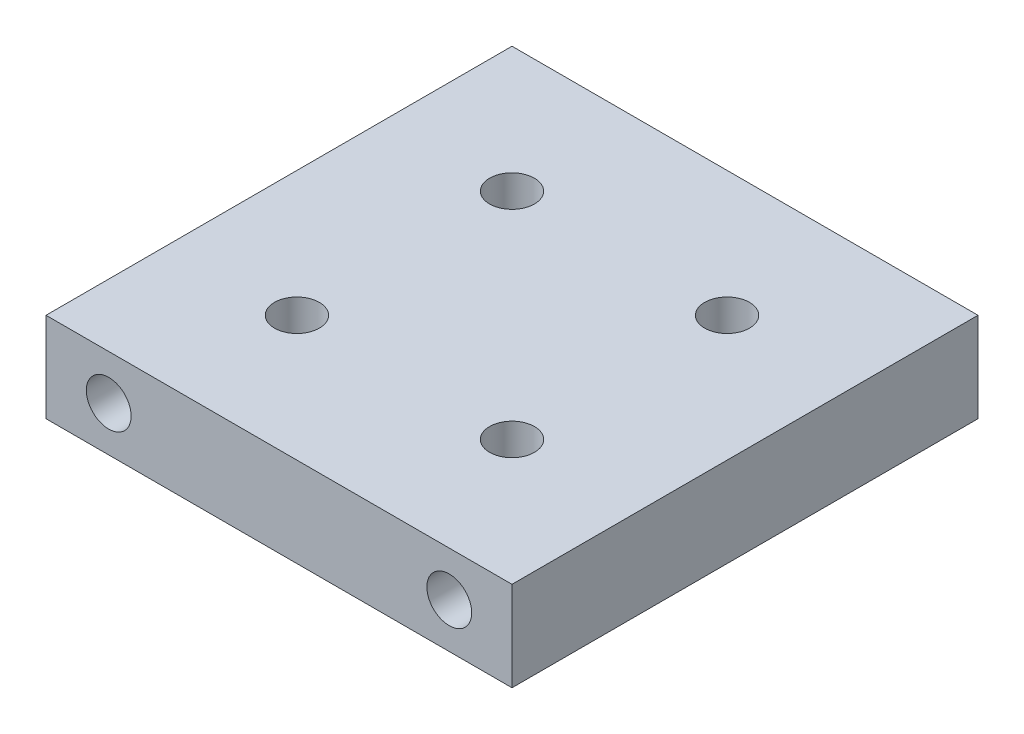
ISO-10303-21;
HEADER;
FILE_DESCRIPTION(('STEP AP214'),'2;1');
FILE_NAME('part.step','',(''),(''),'','','');
FILE_SCHEMA(('AUTOMOTIVE_DESIGN { 1 0 10303 214 1 1 1 1 }'));
ENDSEC;
DATA;
#1=APPLICATION_CONTEXT('core data for automotive mechanical design processes');
#2=APPLICATION_PROTOCOL_DEFINITION('international standard','automotive_design',2000,#1);
#3=PRODUCT_CONTEXT('',#1,'mechanical');
#4=PRODUCT('Part','Part','',(#3));
#5=PRODUCT_RELATED_PRODUCT_CATEGORY('part','',(#4));
#6=PRODUCT_DEFINITION_FORMATION('','',#4);
#7=PRODUCT_DEFINITION_CONTEXT('part definition',#1,'design');
#8=PRODUCT_DEFINITION('design','',#6,#7);
#9=PRODUCT_DEFINITION_SHAPE('','',#8);
#10=(LENGTH_UNIT() NAMED_UNIT(*) SI_UNIT(.MILLI.,.METRE.));
#11=(NAMED_UNIT(*) PLANE_ANGLE_UNIT() SI_UNIT($,.RADIAN.));
#12=(NAMED_UNIT(*) SI_UNIT($,.STERADIAN.) SOLID_ANGLE_UNIT());
#13=UNCERTAINTY_MEASURE_WITH_UNIT(LENGTH_MEASURE(1.E-05),#10,'distance_accuracy_value','');
#14=(GEOMETRIC_REPRESENTATION_CONTEXT(3) GLOBAL_UNCERTAINTY_ASSIGNED_CONTEXT((#13)) GLOBAL_UNIT_ASSIGNED_CONTEXT((#10,
#11,#12)) REPRESENTATION_CONTEXT('',''));
#15=CARTESIAN_POINT('',(0.,0.,0.));
#16=DIRECTION('',(0.,0.,1.));
#17=DIRECTION('',(1.,0.,0.));
#18=AXIS2_PLACEMENT_3D('',#15,#16,#17);
#19=CARTESIAN_POINT('',(0.,5.,0.));
#20=DIRECTION('',(0.,-1.,0.));
#21=DIRECTION('',(0.,0.,-1.));
#22=AXIS2_PLACEMENT_3D('',#19,#20,#21);
#23=PLANE('',#22);
#24=DIRECTION('',(0.,0.,1.));
#25=VECTOR('',#24,1.);
#26=CARTESIAN_POINT('',(-13.,5.,-13.));
#27=LINE('',#26,#25);
#28=CARTESIAN_POINT('',(-13.,5.,-13.));
#29=VERTEX_POINT('',#28);
#30=CARTESIAN_POINT('',(-13.,5.,13.));
#31=VERTEX_POINT('',#30);
#32=EDGE_CURVE('E96',#29,#31,#27,.T.);
#33=ORIENTED_EDGE('',*,*,#32,.T.);
#34=DIRECTION('',(1.,0.,0.));
#35=VECTOR('',#34,1.);
#36=CARTESIAN_POINT('',(13.,5.,13.));
#37=LINE('',#36,#35);
#38=CARTESIAN_POINT('',(13.,5.,13.));
#39=VERTEX_POINT('',#38);
#40=EDGE_CURVE('E91',#31,#39,#37,.T.);
#41=ORIENTED_EDGE('',*,*,#40,.T.);
#42=DIRECTION('',(0.,0.,-1.));
#43=VECTOR('',#42,1.);
#44=CARTESIAN_POINT('',(13.,5.,-13.));
#45=LINE('',#44,#43);
#46=CARTESIAN_POINT('',(13.,5.,-13.));
#47=VERTEX_POINT('',#46);
#48=EDGE_CURVE('E94',#39,#47,#45,.T.);
#49=ORIENTED_EDGE('',*,*,#48,.T.);
#50=DIRECTION('',(-1.,0.,0.));
#51=VECTOR('',#50,1.);
#52=CARTESIAN_POINT('',(13.,5.,-13.));
#53=LINE('',#52,#51);
#54=EDGE_CURVE('E61',#47,#29,#53,.T.);
#55=ORIENTED_EDGE('',*,*,#54,.T.);
#56=EDGE_LOOP('',(#33,#41,#49,#55));
#57=FACE_BOUND('',#56,.T.);
#58=CARTESIAN_POINT('',(-6.,5.,6.));
#59=DIRECTION('',(0.,1.,0.));
#60=DIRECTION('',(0.,0.,1.));
#61=AXIS2_PLACEMENT_3D('',#58,#59,#60);
#62=CIRCLE('',#61,1.25);
#63=CARTESIAN_POINT('',(-6.,5.,7.25));
#64=VERTEX_POINT('',#63);
#65=EDGE_CURVE('E116',#64,#64,#62,.T.);
#66=ORIENTED_EDGE('',*,*,#65,.F.);
#67=EDGE_LOOP('',(#66));
#68=FACE_BOUND('',#67,.T.);
#69=CARTESIAN_POINT('',(6.,5.,6.));
#70=DIRECTION('',(0.,1.,0.));
#71=DIRECTION('',(0.,0.,1.));
#72=AXIS2_PLACEMENT_3D('',#69,#70,#71);
#73=CIRCLE('',#72,1.25);
#74=CARTESIAN_POINT('',(6.,5.,7.25));
#75=VERTEX_POINT('',#74);
#76=EDGE_CURVE('E138',#75,#75,#73,.T.);
#77=ORIENTED_EDGE('',*,*,#76,.F.);
#78=EDGE_LOOP('',(#77));
#79=FACE_BOUND('',#78,.T.);
#80=CARTESIAN_POINT('',(6.,5.,-6.));
#81=DIRECTION('',(0.,1.,0.));
#82=DIRECTION('',(0.,0.,1.));
#83=AXIS2_PLACEMENT_3D('',#80,#81,#82);
#84=CIRCLE('',#83,1.25);
#85=CARTESIAN_POINT('',(6.,5.,-4.75));
#86=VERTEX_POINT('',#85);
#87=EDGE_CURVE('E146',#86,#86,#84,.T.);
#88=ORIENTED_EDGE('',*,*,#87,.F.);
#89=EDGE_LOOP('',(#88));
#90=FACE_BOUND('',#89,.T.);
#91=CARTESIAN_POINT('',(-6.,5.,-6.));
#92=DIRECTION('',(0.,1.,0.));
#93=DIRECTION('',(0.,0.,1.));
#94=AXIS2_PLACEMENT_3D('',#91,#92,#93);
#95=CIRCLE('',#94,1.25);
#96=CARTESIAN_POINT('',(-6.,5.,-4.75));
#97=VERTEX_POINT('',#96);
#98=EDGE_CURVE('E154',#97,#97,#95,.T.);
#99=ORIENTED_EDGE('',*,*,#98,.F.);
#100=EDGE_LOOP('',(#99));
#101=FACE_BOUND('',#100,.T.);
#102=ADVANCED_FACE('F43',(#57,#68,#79,#90,#101),#23,.F.);
#103=CARTESIAN_POINT('',(0.,0.,0.));
#104=DIRECTION('',(0.,-1.,0.));
#105=DIRECTION('',(0.,0.,-1.));
#106=AXIS2_PLACEMENT_3D('',#103,#104,#105);
#107=PLANE('',#106);
#108=CARTESIAN_POINT('',(6.,0.,-6.));
#109=DIRECTION('',(0.,1.,0.));
#110=DIRECTION('',(0.,0.,1.));
#111=AXIS2_PLACEMENT_3D('',#108,#109,#110);
#112=CIRCLE('',#111,1.25);
#113=CARTESIAN_POINT('',(6.,0.,-4.75));
#114=VERTEX_POINT('',#113);
#115=EDGE_CURVE('E150',#114,#114,#112,.T.);
#116=ORIENTED_EDGE('',*,*,#115,.T.);
#117=EDGE_LOOP('',(#116));
#118=FACE_BOUND('',#117,.T.);
#119=CARTESIAN_POINT('',(-6.,0.,6.));
#120=DIRECTION('',(0.,1.,0.));
#121=DIRECTION('',(0.,0.,1.));
#122=AXIS2_PLACEMENT_3D('',#119,#120,#121);
#123=CIRCLE('',#122,1.25);
#124=CARTESIAN_POINT('',(-6.,0.,7.25));
#125=VERTEX_POINT('',#124);
#126=EDGE_CURVE('E134',#125,#125,#123,.T.);
#127=ORIENTED_EDGE('',*,*,#126,.T.);
#128=EDGE_LOOP('',(#127));
#129=FACE_BOUND('',#128,.T.);
#130=DIRECTION('',(0.,0.,1.));
#131=VECTOR('',#130,1.);
#132=CARTESIAN_POINT('',(-13.,0.,-13.));
#133=LINE('',#132,#131);
#134=CARTESIAN_POINT('',(-13.,0.,-13.));
#135=VERTEX_POINT('',#134);
#136=CARTESIAN_POINT('',(-13.,0.,13.));
#137=VERTEX_POINT('',#136);
#138=EDGE_CURVE('E112',#135,#137,#133,.T.);
#139=ORIENTED_EDGE('',*,*,#138,.F.);
#140=DIRECTION('',(-1.,0.,0.));
#141=VECTOR('',#140,1.);
#142=CARTESIAN_POINT('',(13.,0.,-13.));
#143=LINE('',#142,#141);
#144=CARTESIAN_POINT('',(13.,0.,-13.));
#145=VERTEX_POINT('',#144);
#146=EDGE_CURVE('E84',#145,#135,#143,.T.);
#147=ORIENTED_EDGE('',*,*,#146,.F.);
#148=DIRECTION('',(0.,0.,-1.));
#149=VECTOR('',#148,1.);
#150=CARTESIAN_POINT('',(13.,0.,-13.));
#151=LINE('',#150,#149);
#152=CARTESIAN_POINT('',(13.,0.,13.));
#153=VERTEX_POINT('',#152);
#154=EDGE_CURVE('E78',#153,#145,#151,.T.);
#155=ORIENTED_EDGE('',*,*,#154,.F.);
#156=DIRECTION('',(1.,0.,0.));
#157=VECTOR('',#156,1.);
#158=CARTESIAN_POINT('',(13.,0.,13.));
#159=LINE('',#158,#157);
#160=EDGE_CURVE('E101',#137,#153,#159,.T.);
#161=ORIENTED_EDGE('',*,*,#160,.F.);
#162=EDGE_LOOP('',(#139,#147,#155,#161));
#163=FACE_BOUND('',#162,.T.);
#164=CARTESIAN_POINT('',(6.,0.,6.));
#165=DIRECTION('',(0.,1.,0.));
#166=DIRECTION('',(0.,0.,1.));
#167=AXIS2_PLACEMENT_3D('',#164,#165,#166);
#168=CIRCLE('',#167,1.25);
#169=CARTESIAN_POINT('',(6.,0.,7.25));
#170=VERTEX_POINT('',#169);
#171=EDGE_CURVE('E142',#170,#170,#168,.T.);
#172=ORIENTED_EDGE('',*,*,#171,.T.);
#173=EDGE_LOOP('',(#172));
#174=FACE_BOUND('',#173,.T.);
#175=CARTESIAN_POINT('',(-6.,0.,-6.));
#176=DIRECTION('',(0.,1.,0.));
#177=DIRECTION('',(0.,0.,1.));
#178=AXIS2_PLACEMENT_3D('',#175,#176,#177);
#179=CIRCLE('',#178,1.25);
#180=CARTESIAN_POINT('',(-6.,0.,-4.75));
#181=VERTEX_POINT('',#180);
#182=EDGE_CURVE('E158',#181,#181,#179,.T.);
#183=ORIENTED_EDGE('',*,*,#182,.T.);
#184=EDGE_LOOP('',(#183));
#185=FACE_BOUND('',#184,.T.);
#186=ADVANCED_FACE('F129',(#118,#129,#163,#174,#185),#107,.T.);
#187=CARTESIAN_POINT('',(-13.,5.,-13.));
#188=DIRECTION('',(1.,0.,0.));
#189=DIRECTION('',(0.,0.,-1.));
#190=AXIS2_PLACEMENT_3D('',#187,#188,#189);
#191=PLANE('',#190);
#192=ORIENTED_EDGE('',*,*,#138,.T.);
#193=DIRECTION('',(0.,-1.,0.));
#194=VECTOR('',#193,1.);
#195=CARTESIAN_POINT('',(-13.,5.,13.));
#196=LINE('',#195,#194);
#197=EDGE_CURVE('E11',#31,#137,#196,.T.);
#198=ORIENTED_EDGE('',*,*,#197,.F.);
#199=ORIENTED_EDGE('',*,*,#32,.F.);
#200=DIRECTION('',(0.,-1.,0.));
#201=VECTOR('',#200,1.);
#202=CARTESIAN_POINT('',(-13.,5.,-13.));
#203=LINE('',#202,#201);
#204=EDGE_CURVE('E108',#29,#135,#203,.T.);
#205=ORIENTED_EDGE('',*,*,#204,.T.);
#206=EDGE_LOOP('',(#192,#198,#199,#205));
#207=FACE_BOUND('',#206,.T.);
#208=ADVANCED_FACE('F45',(#207),#191,.F.);
#209=CARTESIAN_POINT('',(13.,5.,13.));
#210=DIRECTION('',(0.,0.,-1.));
#211=DIRECTION('',(-1.,0.,0.));
#212=AXIS2_PLACEMENT_3D('',#209,#210,#211);
#213=PLANE('',#212);
#214=CARTESIAN_POINT('',(-9.5,2.5,13.));
#215=DIRECTION('',(0.,0.,1.));
#216=DIRECTION('',(1.,0.,0.));
#217=AXIS2_PLACEMENT_3D('',#214,#215,#216);
#218=CIRCLE('',#217,1.25);
#219=CARTESIAN_POINT('',(-8.25,2.5,13.));
#220=VERTEX_POINT('',#219);
#221=EDGE_CURVE('E175',#220,#220,#218,.T.);
#222=ORIENTED_EDGE('',*,*,#221,.F.);
#223=EDGE_LOOP('',(#222));
#224=FACE_BOUND('',#223,.T.);
#225=CARTESIAN_POINT('',(9.5,2.5,13.));
#226=DIRECTION('',(0.,0.,1.));
#227=DIRECTION('',(-1.,0.,0.));
#228=AXIS2_PLACEMENT_3D('',#225,#226,#227);
#229=CIRCLE('',#228,1.25);
#230=CARTESIAN_POINT('',(8.25,2.5,13.));
#231=VERTEX_POINT('',#230);
#232=EDGE_CURVE('E170',#231,#231,#229,.T.);
#233=ORIENTED_EDGE('',*,*,#232,.F.);
#234=EDGE_LOOP('',(#233));
#235=FACE_BOUND('',#234,.T.);
#236=ORIENTED_EDGE('',*,*,#160,.T.);
#237=DIRECTION('',(0.,-1.,0.));
#238=VECTOR('',#237,1.);
#239=CARTESIAN_POINT('',(13.,5.,13.));
#240=LINE('',#239,#238);
#241=EDGE_CURVE('E53',#39,#153,#240,.T.);
#242=ORIENTED_EDGE('',*,*,#241,.F.);
#243=ORIENTED_EDGE('',*,*,#40,.F.);
#244=ORIENTED_EDGE('',*,*,#197,.T.);
#245=EDGE_LOOP('',(#236,#242,#243,#244));
#246=FACE_BOUND('',#245,.T.);
#247=ADVANCED_FACE('F100',(#224,#235,#246),#213,.F.);
#248=CARTESIAN_POINT('',(13.,5.,-13.));
#249=DIRECTION('',(-1.,0.,0.));
#250=DIRECTION('',(0.,0.,1.));
#251=AXIS2_PLACEMENT_3D('',#248,#249,#250);
#252=PLANE('',#251);
#253=ORIENTED_EDGE('',*,*,#154,.T.);
#254=DIRECTION('',(0.,-1.,0.));
#255=VECTOR('',#254,1.);
#256=CARTESIAN_POINT('',(13.,5.,-13.));
#257=LINE('',#256,#255);
#258=EDGE_CURVE('E103',#47,#145,#257,.T.);
#259=ORIENTED_EDGE('',*,*,#258,.F.);
#260=ORIENTED_EDGE('',*,*,#48,.F.);
#261=ORIENTED_EDGE('',*,*,#241,.T.);
#262=EDGE_LOOP('',(#253,#259,#260,#261));
#263=FACE_BOUND('',#262,.T.);
#264=ADVANCED_FACE('F104',(#263),#252,.F.);
#265=CARTESIAN_POINT('',(13.,5.,-13.));
#266=DIRECTION('',(0.,0.,1.));
#267=DIRECTION('',(1.,0.,0.));
#268=AXIS2_PLACEMENT_3D('',#265,#266,#267);
#269=PLANE('',#268);
#270=CARTESIAN_POINT('',(-9.5,2.5,-13.));
#271=DIRECTION('',(0.,0.,1.));
#272=DIRECTION('',(1.,0.,0.));
#273=AXIS2_PLACEMENT_3D('',#270,#271,#272);
#274=CIRCLE('',#273,1.25);
#275=CARTESIAN_POINT('',(-8.25,2.5,-13.));
#276=VERTEX_POINT('',#275);
#277=EDGE_CURVE('E171',#276,#276,#274,.T.);
#278=ORIENTED_EDGE('',*,*,#277,.T.);
#279=EDGE_LOOP('',(#278));
#280=FACE_BOUND('',#279,.T.);
#281=CARTESIAN_POINT('',(9.49999999999999,2.5,-13.));
#282=DIRECTION('',(0.,0.,1.));
#283=DIRECTION('',(-1.,0.,0.));
#284=AXIS2_PLACEMENT_3D('',#281,#282,#283);
#285=CIRCLE('',#284,1.25);
#286=CARTESIAN_POINT('',(8.24999999999999,2.5,-13.));
#287=VERTEX_POINT('',#286);
#288=EDGE_CURVE('E186',#287,#287,#285,.T.);
#289=ORIENTED_EDGE('',*,*,#288,.T.);
#290=EDGE_LOOP('',(#289));
#291=FACE_BOUND('',#290,.T.);
#292=ORIENTED_EDGE('',*,*,#146,.T.);
#293=ORIENTED_EDGE('',*,*,#204,.F.);
#294=ORIENTED_EDGE('',*,*,#54,.F.);
#295=ORIENTED_EDGE('',*,*,#258,.T.);
#296=EDGE_LOOP('',(#292,#293,#294,#295));
#297=FACE_BOUND('',#296,.T.);
#298=ADVANCED_FACE('F126',(#280,#291,#297),#269,.F.);
#299=CARTESIAN_POINT('',(-6.,5.,6.));
#300=DIRECTION('',(0.,-1.,0.));
#301=DIRECTION('',(0.,0.,-1.));
#302=AXIS2_PLACEMENT_3D('',#299,#300,#301);
#303=CYLINDRICAL_SURFACE('',#302,1.25);
#304=ORIENTED_EDGE('',*,*,#65,.T.);
#305=EDGE_LOOP('',(#304));
#306=FACE_BOUND('',#305,.T.);
#307=ORIENTED_EDGE('',*,*,#126,.F.);
#308=EDGE_LOOP('',(#307));
#309=FACE_BOUND('',#308,.T.);
#310=ADVANCED_FACE('F220',(#306,#309),#303,.F.);
#311=CARTESIAN_POINT('',(6.,5.,6.));
#312=DIRECTION('',(0.,-1.,0.));
#313=DIRECTION('',(0.,0.,-1.));
#314=AXIS2_PLACEMENT_3D('',#311,#312,#313);
#315=CYLINDRICAL_SURFACE('',#314,1.25);
#316=ORIENTED_EDGE('',*,*,#76,.T.);
#317=EDGE_LOOP('',(#316));
#318=FACE_BOUND('',#317,.T.);
#319=ORIENTED_EDGE('',*,*,#171,.F.);
#320=EDGE_LOOP('',(#319));
#321=FACE_BOUND('',#320,.T.);
#322=ADVANCED_FACE('F256',(#318,#321),#315,.F.);
#323=CARTESIAN_POINT('',(6.,5.,-6.));
#324=DIRECTION('',(0.,-1.,0.));
#325=DIRECTION('',(0.,0.,-1.));
#326=AXIS2_PLACEMENT_3D('',#323,#324,#325);
#327=CYLINDRICAL_SURFACE('',#326,1.25);
#328=ORIENTED_EDGE('',*,*,#87,.T.);
#329=EDGE_LOOP('',(#328));
#330=FACE_BOUND('',#329,.T.);
#331=ORIENTED_EDGE('',*,*,#115,.F.);
#332=EDGE_LOOP('',(#331));
#333=FACE_BOUND('',#332,.T.);
#334=ADVANCED_FACE('F248',(#330,#333),#327,.F.);
#335=CARTESIAN_POINT('',(-6.,5.,-6.));
#336=DIRECTION('',(0.,-1.,0.));
#337=DIRECTION('',(0.,0.,-1.));
#338=AXIS2_PLACEMENT_3D('',#335,#336,#337);
#339=CYLINDRICAL_SURFACE('',#338,1.25);
#340=ORIENTED_EDGE('',*,*,#98,.T.);
#341=EDGE_LOOP('',(#340));
#342=FACE_BOUND('',#341,.T.);
#343=ORIENTED_EDGE('',*,*,#182,.F.);
#344=EDGE_LOOP('',(#343));
#345=FACE_BOUND('',#344,.T.);
#346=ADVANCED_FACE('F238',(#342,#345),#339,.F.);
#347=CARTESIAN_POINT('',(9.5,2.5,3.));
#348=DIRECTION('',(0.,0.,1.));
#349=DIRECTION('',(1.,0.,0.));
#350=AXIS2_PLACEMENT_3D('',#347,#348,#349);
#351=CYLINDRICAL_SURFACE('',#350,1.25);
#352=CARTESIAN_POINT('',(9.5,2.5,3.));
#353=DIRECTION('',(0.,0.,1.));
#354=DIRECTION('',(-1.,0.,0.));
#355=AXIS2_PLACEMENT_3D('',#352,#353,#354);
#356=CIRCLE('',#355,1.25);
#357=CARTESIAN_POINT('',(8.25,2.5,3.));
#358=VERTEX_POINT('',#357);
#359=EDGE_CURVE('E166',#358,#358,#356,.T.);
#360=ORIENTED_EDGE('',*,*,#359,.F.);
#361=EDGE_LOOP('',(#360));
#362=FACE_BOUND('',#361,.T.);
#363=ORIENTED_EDGE('',*,*,#232,.T.);
#364=EDGE_LOOP('',(#363));
#365=FACE_BOUND('',#364,.T.);
#366=ADVANCED_FACE('F235',(#362,#365),#351,.F.);
#367=CARTESIAN_POINT('',(9.5,2.5,3.));
#368=DIRECTION('',(0.,0.,-1.));
#369=DIRECTION('',(-1.,0.,0.));
#370=AXIS2_PLACEMENT_3D('',#367,#368,#369);
#371=PLANE('',#370);
#372=ORIENTED_EDGE('',*,*,#359,.T.);
#373=EDGE_LOOP('',(#372));
#374=FACE_BOUND('',#373,.T.);
#375=ADVANCED_FACE('F237',(#374),#371,.F.);
#376=CARTESIAN_POINT('',(-9.5,2.5,3.));
#377=DIRECTION('',(0.,0.,1.));
#378=DIRECTION('',(1.,0.,0.));
#379=AXIS2_PLACEMENT_3D('',#376,#377,#378);
#380=CYLINDRICAL_SURFACE('',#379,1.25);
#381=CARTESIAN_POINT('',(-9.5,2.5,3.));
#382=DIRECTION('',(0.,0.,1.));
#383=DIRECTION('',(1.,0.,0.));
#384=AXIS2_PLACEMENT_3D('',#381,#382,#383);
#385=CIRCLE('',#384,1.25);
#386=CARTESIAN_POINT('',(-8.25,2.5,3.));
#387=VERTEX_POINT('',#386);
#388=EDGE_CURVE('E162',#387,#387,#385,.T.);
#389=ORIENTED_EDGE('',*,*,#388,.F.);
#390=EDGE_LOOP('',(#389));
#391=FACE_BOUND('',#390,.T.);
#392=ORIENTED_EDGE('',*,*,#221,.T.);
#393=EDGE_LOOP('',(#392));
#394=FACE_BOUND('',#393,.T.);
#395=ADVANCED_FACE('F245',(#391,#394),#380,.F.);
#396=CARTESIAN_POINT('',(-9.5,2.5,3.));
#397=DIRECTION('',(0.,0.,1.));
#398=DIRECTION('',(1.,0.,0.));
#399=AXIS2_PLACEMENT_3D('',#396,#397,#398);
#400=PLANE('',#399);
#401=ORIENTED_EDGE('',*,*,#388,.T.);
#402=EDGE_LOOP('',(#401));
#403=FACE_BOUND('',#402,.T.);
#404=ADVANCED_FACE('F367',(#403),#400,.T.);
#405=CARTESIAN_POINT('',(9.49999999999999,2.5,-13.));
#406=DIRECTION('',(0.,0.,1.));
#407=DIRECTION('',(1.,0.,0.));
#408=AXIS2_PLACEMENT_3D('',#405,#406,#407);
#409=CYLINDRICAL_SURFACE('',#408,1.25);
#410=ORIENTED_EDGE('',*,*,#288,.F.);
#411=EDGE_LOOP('',(#410));
#412=FACE_BOUND('',#411,.T.);
#413=CARTESIAN_POINT('',(9.49999999999999,2.5,-3.));
#414=DIRECTION('',(0.,0.,1.));
#415=DIRECTION('',(-1.,0.,0.));
#416=AXIS2_PLACEMENT_3D('',#413,#414,#415);
#417=CIRCLE('',#416,1.25);
#418=CARTESIAN_POINT('',(8.24999999999999,2.5,-3.));
#419=VERTEX_POINT('',#418);
#420=EDGE_CURVE('E182',#419,#419,#417,.T.);
#421=ORIENTED_EDGE('',*,*,#420,.T.);
#422=EDGE_LOOP('',(#421));
#423=FACE_BOUND('',#422,.T.);
#424=ADVANCED_FACE('F376',(#412,#423),#409,.F.);
#425=CARTESIAN_POINT('',(9.49999999999999,2.5,-3.));
#426=DIRECTION('',(0.,0.,-1.));
#427=DIRECTION('',(-1.,0.,0.));
#428=AXIS2_PLACEMENT_3D('',#425,#426,#427);
#429=PLANE('',#428);
#430=ORIENTED_EDGE('',*,*,#420,.F.);
#431=EDGE_LOOP('',(#430));
#432=FACE_BOUND('',#431,.T.);
#433=ADVANCED_FACE('F204',(#432),#429,.T.);
#434=CARTESIAN_POINT('',(-9.5,2.5,-13.));
#435=DIRECTION('',(0.,0.,1.));
#436=DIRECTION('',(1.,0.,0.));
#437=AXIS2_PLACEMENT_3D('',#434,#435,#436);
#438=CYLINDRICAL_SURFACE('',#437,1.25);
#439=ORIENTED_EDGE('',*,*,#277,.F.);
#440=EDGE_LOOP('',(#439));
#441=FACE_BOUND('',#440,.T.);
#442=CARTESIAN_POINT('',(-9.5,2.5,-3.));
#443=DIRECTION('',(0.,0.,1.));
#444=DIRECTION('',(1.,0.,0.));
#445=AXIS2_PLACEMENT_3D('',#442,#443,#444);
#446=CIRCLE('',#445,1.25);
#447=CARTESIAN_POINT('',(-8.25,2.5,-3.));
#448=VERTEX_POINT('',#447);
#449=EDGE_CURVE('E190',#448,#448,#446,.T.);
#450=ORIENTED_EDGE('',*,*,#449,.T.);
#451=EDGE_LOOP('',(#450));
#452=FACE_BOUND('',#451,.T.);
#453=ADVANCED_FACE('F200',(#441,#452),#438,.F.);
#454=CARTESIAN_POINT('',(-9.5,2.5,-3.));
#455=DIRECTION('',(0.,0.,1.));
#456=DIRECTION('',(1.,0.,0.));
#457=AXIS2_PLACEMENT_3D('',#454,#455,#456);
#458=PLANE('',#457);
#459=ORIENTED_EDGE('',*,*,#449,.F.);
#460=EDGE_LOOP('',(#459));
#461=FACE_BOUND('',#460,.T.);
#462=ADVANCED_FACE('F203',(#461),#458,.F.);
#463=CLOSED_SHELL('',(#102,#186,#208,#247,#264,#298,#310,#322,#334,#346,#366,#375,#395,#404,
#424,#433,#453,#462));
#464=MANIFOLD_SOLID_BREP('B2',#463);
#465=ADVANCED_BREP_SHAPE_REPRESENTATION('',(#18,#464),#14);
#466=SHAPE_DEFINITION_REPRESENTATION(#9,#465);
ENDSEC;
END-ISO-10303-21;
